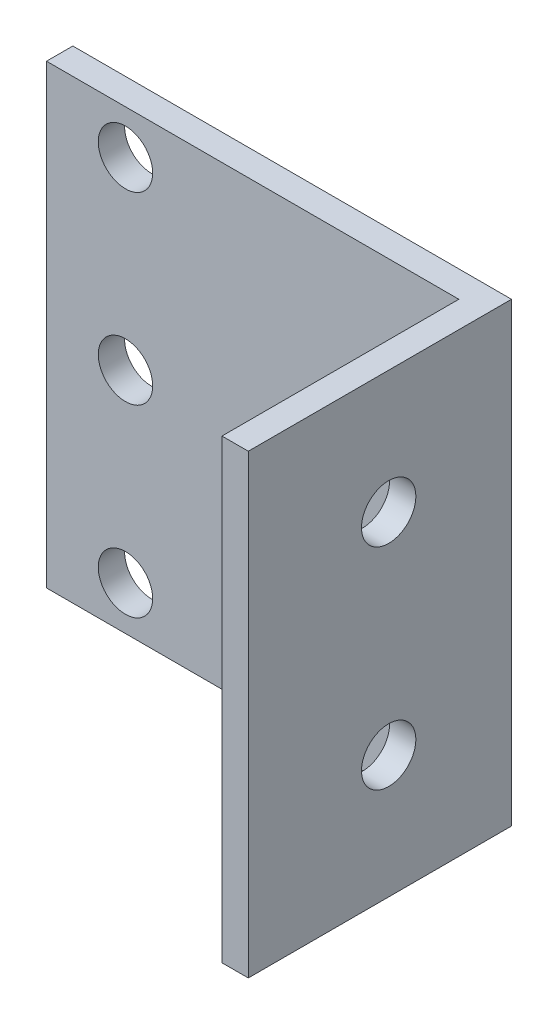
ISO-10303-21;
HEADER;
FILE_DESCRIPTION(('STEP AP214'),'2;1');
FILE_NAME('part.step','',(''),(''),'','','');
FILE_SCHEMA(('AUTOMOTIVE_DESIGN { 1 0 10303 214 1 1 1 1 }'));
ENDSEC;
DATA;
#1=APPLICATION_CONTEXT('core data for automotive mechanical design processes');
#2=APPLICATION_PROTOCOL_DEFINITION('international standard','automotive_design',2000,#1);
#3=PRODUCT_CONTEXT('',#1,'mechanical');
#4=PRODUCT('Part','Part','',(#3));
#5=PRODUCT_RELATED_PRODUCT_CATEGORY('part','',(#4));
#6=PRODUCT_DEFINITION_FORMATION('','',#4);
#7=PRODUCT_DEFINITION_CONTEXT('part definition',#1,'design');
#8=PRODUCT_DEFINITION('design','',#6,#7);
#9=PRODUCT_DEFINITION_SHAPE('','',#8);
#10=(LENGTH_UNIT() NAMED_UNIT(*) SI_UNIT(.MILLI.,.METRE.));
#11=(NAMED_UNIT(*) PLANE_ANGLE_UNIT() SI_UNIT($,.RADIAN.));
#12=(NAMED_UNIT(*) SI_UNIT($,.STERADIAN.) SOLID_ANGLE_UNIT());
#13=UNCERTAINTY_MEASURE_WITH_UNIT(LENGTH_MEASURE(1.E-05),#10,'distance_accuracy_value','');
#14=(GEOMETRIC_REPRESENTATION_CONTEXT(3) GLOBAL_UNCERTAINTY_ASSIGNED_CONTEXT((#13)) GLOBAL_UNIT_ASSIGNED_CONTEXT((#10,
#11,#12)) REPRESENTATION_CONTEXT('',''));
#15=CARTESIAN_POINT('',(0.,0.,0.));
#16=DIRECTION('',(0.,0.,1.));
#17=DIRECTION('',(1.,0.,0.));
#18=AXIS2_PLACEMENT_3D('',#15,#16,#17);
#19=CARTESIAN_POINT('',(0.,0.,1.5));
#20=DIRECTION('',(0.,0.,1.));
#21=DIRECTION('',(1.,0.,0.));
#22=AXIS2_PLACEMENT_3D('',#19,#20,#21);
#23=PLANE('',#22);
#24=DIRECTION('',(0.,-1.,0.));
#25=VECTOR('',#24,1.);
#26=CARTESIAN_POINT('',(19.,13.,1.5));
#27=LINE('',#26,#25);
#28=CARTESIAN_POINT('',(19.,13.,1.5));
#29=VERTEX_POINT('',#28);
#30=CARTESIAN_POINT('',(19.,-13.,1.5));
#31=VERTEX_POINT('',#30);
#32=EDGE_CURVE('E49',#29,#31,#27,.T.);
#33=ORIENTED_EDGE('',*,*,#32,.F.);
#34=DIRECTION('',(-1.,0.,0.));
#35=VECTOR('',#34,1.);
#36=CARTESIAN_POINT('',(-4.5,13.,1.5));
#37=LINE('',#36,#35);
#38=CARTESIAN_POINT('',(-4.5,13.,1.5));
#39=VERTEX_POINT('',#38);
#40=EDGE_CURVE('E54',#29,#39,#37,.T.);
#41=ORIENTED_EDGE('',*,*,#40,.T.);
#42=DIRECTION('',(0.,-1.,0.));
#43=VECTOR('',#42,1.);
#44=CARTESIAN_POINT('',(-4.5,13.,1.5));
#45=LINE('',#44,#43);
#46=CARTESIAN_POINT('',(-4.5,-13.,1.5));
#47=VERTEX_POINT('',#46);
#48=EDGE_CURVE('E85',#39,#47,#45,.T.);
#49=ORIENTED_EDGE('',*,*,#48,.T.);
#50=DIRECTION('',(1.,0.,0.));
#51=VECTOR('',#50,1.);
#52=CARTESIAN_POINT('',(-4.5,-13.,1.5));
#53=LINE('',#52,#51);
#54=EDGE_CURVE('E110',#47,#31,#53,.T.);
#55=ORIENTED_EDGE('',*,*,#54,.T.);
#56=EDGE_LOOP('',(#33,#41,#49,#55));
#57=FACE_BOUND('',#56,.T.);
#58=CARTESIAN_POINT('',(0.,0.,1.5));
#59=DIRECTION('',(0.,0.,1.));
#60=DIRECTION('',(1.,0.,0.));
#61=AXIS2_PLACEMENT_3D('',#58,#59,#60);
#62=CIRCLE('',#61,1.55);
#63=CARTESIAN_POINT('',(1.55,0.,1.5));
#64=VERTEX_POINT('',#63);
#65=EDGE_CURVE('E117',#64,#64,#62,.T.);
#66=ORIENTED_EDGE('',*,*,#65,.F.);
#67=EDGE_LOOP('',(#66));
#68=FACE_BOUND('',#67,.T.);
#69=CARTESIAN_POINT('',(0.,10.5,1.5));
#70=DIRECTION('',(0.,0.,1.));
#71=DIRECTION('',(1.,0.,0.));
#72=AXIS2_PLACEMENT_3D('',#69,#70,#71);
#73=CIRCLE('',#72,1.55);
#74=CARTESIAN_POINT('',(1.55,10.5,1.5));
#75=VERTEX_POINT('',#74);
#76=EDGE_CURVE('E96',#75,#75,#73,.T.);
#77=ORIENTED_EDGE('',*,*,#76,.F.);
#78=EDGE_LOOP('',(#77));
#79=FACE_BOUND('',#78,.T.);
#80=CARTESIAN_POINT('',(0.,-10.5,1.5));
#81=DIRECTION('',(0.,0.,1.));
#82=DIRECTION('',(1.,0.,0.));
#83=AXIS2_PLACEMENT_3D('',#80,#81,#82);
#84=CIRCLE('',#83,1.55);
#85=CARTESIAN_POINT('',(1.55,-10.5,1.5));
#86=VERTEX_POINT('',#85);
#87=EDGE_CURVE('E122',#86,#86,#84,.T.);
#88=ORIENTED_EDGE('',*,*,#87,.F.);
#89=EDGE_LOOP('',(#88));
#90=FACE_BOUND('',#89,.T.);
#91=ADVANCED_FACE('F32',(#57,#68,#79,#90),#23,.T.);
#92=CARTESIAN_POINT('',(0.,0.,0.));
#93=DIRECTION('',(0.,0.,1.));
#94=DIRECTION('',(1.,0.,0.));
#95=AXIS2_PLACEMENT_3D('',#92,#93,#94);
#96=PLANE('',#95);
#97=CARTESIAN_POINT('',(0.,0.,0.));
#98=DIRECTION('',(0.,0.,1.));
#99=DIRECTION('',(1.,0.,0.));
#100=AXIS2_PLACEMENT_3D('',#97,#98,#99);
#101=CIRCLE('',#100,1.55);
#102=CARTESIAN_POINT('',(1.55,0.,0.));
#103=VERTEX_POINT('',#102);
#104=EDGE_CURVE('E119',#103,#103,#101,.T.);
#105=ORIENTED_EDGE('',*,*,#104,.T.);
#106=EDGE_LOOP('',(#105));
#107=FACE_BOUND('',#106,.T.);
#108=DIRECTION('',(0.,-1.,0.));
#109=VECTOR('',#108,1.);
#110=CARTESIAN_POINT('',(-4.5,13.,0.));
#111=LINE('',#110,#109);
#112=CARTESIAN_POINT('',(-4.5,13.,0.));
#113=VERTEX_POINT('',#112);
#114=CARTESIAN_POINT('',(-4.5,-13.,0.));
#115=VERTEX_POINT('',#114);
#116=EDGE_CURVE('E91',#113,#115,#111,.T.);
#117=ORIENTED_EDGE('',*,*,#116,.F.);
#118=DIRECTION('',(-1.,0.,0.));
#119=VECTOR('',#118,1.);
#120=CARTESIAN_POINT('',(-4.5,13.,0.));
#121=LINE('',#120,#119);
#122=CARTESIAN_POINT('',(20.5,13.,0.));
#123=VERTEX_POINT('',#122);
#124=EDGE_CURVE('E74',#123,#113,#121,.T.);
#125=ORIENTED_EDGE('',*,*,#124,.F.);
#126=DIRECTION('',(0.,1.,0.));
#127=VECTOR('',#126,1.);
#128=CARTESIAN_POINT('',(20.5,13.,0.));
#129=LINE('',#128,#127);
#130=CARTESIAN_POINT('',(20.5,-13.,0.));
#131=VERTEX_POINT('',#130);
#132=EDGE_CURVE('E86',#131,#123,#129,.T.);
#133=ORIENTED_EDGE('',*,*,#132,.F.);
#134=DIRECTION('',(1.,0.,0.));
#135=VECTOR('',#134,1.);
#136=CARTESIAN_POINT('',(-4.5,-13.,0.));
#137=LINE('',#136,#135);
#138=EDGE_CURVE('E95',#115,#131,#137,.T.);
#139=ORIENTED_EDGE('',*,*,#138,.F.);
#140=EDGE_LOOP('',(#117,#125,#133,#139));
#141=FACE_BOUND('',#140,.T.);
#142=CARTESIAN_POINT('',(0.,10.5,0.));
#143=DIRECTION('',(0.,0.,1.));
#144=DIRECTION('',(1.,0.,0.));
#145=AXIS2_PLACEMENT_3D('',#142,#143,#144);
#146=CIRCLE('',#145,1.55);
#147=CARTESIAN_POINT('',(1.55,10.5,0.));
#148=VERTEX_POINT('',#147);
#149=EDGE_CURVE('E100',#148,#148,#146,.T.);
#150=ORIENTED_EDGE('',*,*,#149,.T.);
#151=EDGE_LOOP('',(#150));
#152=FACE_BOUND('',#151,.T.);
#153=CARTESIAN_POINT('',(0.,-10.5,0.));
#154=DIRECTION('',(0.,0.,1.));
#155=DIRECTION('',(1.,0.,0.));
#156=AXIS2_PLACEMENT_3D('',#153,#154,#155);
#157=CIRCLE('',#156,1.55);
#158=CARTESIAN_POINT('',(1.55,-10.5,0.));
#159=VERTEX_POINT('',#158);
#160=EDGE_CURVE('E125',#159,#159,#157,.T.);
#161=ORIENTED_EDGE('',*,*,#160,.T.);
#162=EDGE_LOOP('',(#161));
#163=FACE_BOUND('',#162,.T.);
#164=ADVANCED_FACE('F93',(#107,#141,#152,#163),#96,.F.);
#165=CARTESIAN_POINT('',(-4.5,13.,1.5));
#166=DIRECTION('',(1.,0.,0.));
#167=DIRECTION('',(0.,0.,-1.));
#168=AXIS2_PLACEMENT_3D('',#165,#166,#167);
#169=PLANE('',#168);
#170=ORIENTED_EDGE('',*,*,#116,.T.);
#171=DIRECTION('',(0.,0.,-1.));
#172=VECTOR('',#171,1.);
#173=CARTESIAN_POINT('',(-4.5,-13.,1.5));
#174=LINE('',#173,#172);
#175=EDGE_CURVE('E11',#47,#115,#174,.T.);
#176=ORIENTED_EDGE('',*,*,#175,.F.);
#177=ORIENTED_EDGE('',*,*,#48,.F.);
#178=DIRECTION('',(0.,0.,-1.));
#179=VECTOR('',#178,1.);
#180=CARTESIAN_POINT('',(-4.5,13.,1.5));
#181=LINE('',#180,#179);
#182=EDGE_CURVE('E77',#39,#113,#181,.T.);
#183=ORIENTED_EDGE('',*,*,#182,.T.);
#184=EDGE_LOOP('',(#170,#176,#177,#183));
#185=FACE_BOUND('',#184,.T.);
#186=ADVANCED_FACE('F34',(#185),#169,.F.);
#187=CARTESIAN_POINT('',(-4.5,-13.,1.5));
#188=DIRECTION('',(0.,1.,0.));
#189=DIRECTION('',(0.,0.,1.));
#190=AXIS2_PLACEMENT_3D('',#187,#188,#189);
#191=PLANE('',#190);
#192=ORIENTED_EDGE('',*,*,#138,.T.);
#193=DIRECTION('',(0.,0.,-1.));
#194=VECTOR('',#193,1.);
#195=CARTESIAN_POINT('',(20.5,-13.,1.5));
#196=LINE('',#195,#194);
#197=CARTESIAN_POINT('',(20.5,-13.,15.));
#198=VERTEX_POINT('',#197);
#199=EDGE_CURVE('E41',#198,#131,#196,.T.);
#200=ORIENTED_EDGE('',*,*,#199,.F.);
#201=DIRECTION('',(1.,0.,0.));
#202=VECTOR('',#201,1.);
#203=CARTESIAN_POINT('',(20.5,-13.,15.));
#204=LINE('',#203,#202);
#205=CARTESIAN_POINT('',(19.,-13.,15.));
#206=VERTEX_POINT('',#205);
#207=EDGE_CURVE('E133',#206,#198,#204,.T.);
#208=ORIENTED_EDGE('',*,*,#207,.F.);
#209=DIRECTION('',(0.,0.,-1.));
#210=VECTOR('',#209,1.);
#211=CARTESIAN_POINT('',(19.,-13.,15.));
#212=LINE('',#211,#210);
#213=EDGE_CURVE('E138',#206,#31,#212,.T.);
#214=ORIENTED_EDGE('',*,*,#213,.T.);
#215=ORIENTED_EDGE('',*,*,#54,.F.);
#216=ORIENTED_EDGE('',*,*,#175,.T.);
#217=EDGE_LOOP('',(#192,#200,#208,#214,#215,#216));
#218=FACE_BOUND('',#217,.T.);
#219=ADVANCED_FACE('F187',(#218),#191,.F.);
#220=CARTESIAN_POINT('',(20.5,13.,1.5));
#221=DIRECTION('',(-1.,0.,0.));
#222=DIRECTION('',(0.,0.,1.));
#223=AXIS2_PLACEMENT_3D('',#220,#221,#222);
#224=PLANE('',#223);
#225=CARTESIAN_POINT('',(20.5,-6.,7.));
#226=DIRECTION('',(1.,0.,0.));
#227=DIRECTION('',(0.,0.,-1.));
#228=AXIS2_PLACEMENT_3D('',#225,#226,#227);
#229=CIRCLE('',#228,1.55);
#230=CARTESIAN_POINT('',(20.5,-6.,5.45));
#231=VERTEX_POINT('',#230);
#232=EDGE_CURVE('E155',#231,#231,#229,.T.);
#233=ORIENTED_EDGE('',*,*,#232,.F.);
#234=EDGE_LOOP('',(#233));
#235=FACE_BOUND('',#234,.T.);
#236=CARTESIAN_POINT('',(20.5,6.,7.));
#237=DIRECTION('',(1.,0.,0.));
#238=DIRECTION('',(0.,0.,-1.));
#239=AXIS2_PLACEMENT_3D('',#236,#237,#238);
#240=CIRCLE('',#239,1.55);
#241=CARTESIAN_POINT('',(20.5,6.,5.45));
#242=VERTEX_POINT('',#241);
#243=EDGE_CURVE('E147',#242,#242,#240,.T.);
#244=ORIENTED_EDGE('',*,*,#243,.F.);
#245=EDGE_LOOP('',(#244));
#246=FACE_BOUND('',#245,.T.);
#247=ORIENTED_EDGE('',*,*,#132,.T.);
#248=DIRECTION('',(0.,0.,-1.));
#249=VECTOR('',#248,1.);
#250=CARTESIAN_POINT('',(20.5,13.,1.5));
#251=LINE('',#250,#249);
#252=CARTESIAN_POINT('',(20.5,13.,15.));
#253=VERTEX_POINT('',#252);
#254=EDGE_CURVE('E81',#253,#123,#251,.T.);
#255=ORIENTED_EDGE('',*,*,#254,.F.);
#256=DIRECTION('',(0.,1.,0.));
#257=VECTOR('',#256,1.);
#258=CARTESIAN_POINT('',(20.5,13.,15.));
#259=LINE('',#258,#257);
#260=EDGE_CURVE('E136',#198,#253,#259,.T.);
#261=ORIENTED_EDGE('',*,*,#260,.F.);
#262=ORIENTED_EDGE('',*,*,#199,.T.);
#263=EDGE_LOOP('',(#247,#255,#261,#262));
#264=FACE_BOUND('',#263,.T.);
#265=ADVANCED_FACE('F177',(#235,#246,#264),#224,.F.);
#266=CARTESIAN_POINT('',(-4.5,13.,1.5));
#267=DIRECTION('',(0.,-1.,0.));
#268=DIRECTION('',(0.,0.,-1.));
#269=AXIS2_PLACEMENT_3D('',#266,#267,#268);
#270=PLANE('',#269);
#271=ORIENTED_EDGE('',*,*,#124,.T.);
#272=ORIENTED_EDGE('',*,*,#182,.F.);
#273=ORIENTED_EDGE('',*,*,#40,.F.);
#274=DIRECTION('',(0.,0.,-1.));
#275=VECTOR('',#274,1.);
#276=CARTESIAN_POINT('',(19.,13.,15.));
#277=LINE('',#276,#275);
#278=CARTESIAN_POINT('',(19.,13.,15.));
#279=VERTEX_POINT('',#278);
#280=EDGE_CURVE('E128',#279,#29,#277,.T.);
#281=ORIENTED_EDGE('',*,*,#280,.F.);
#282=DIRECTION('',(-1.,0.,0.));
#283=VECTOR('',#282,1.);
#284=CARTESIAN_POINT('',(20.5,13.,15.));
#285=LINE('',#284,#283);
#286=EDGE_CURVE('E160',#253,#279,#285,.T.);
#287=ORIENTED_EDGE('',*,*,#286,.F.);
#288=ORIENTED_EDGE('',*,*,#254,.T.);
#289=EDGE_LOOP('',(#271,#272,#273,#281,#287,#288));
#290=FACE_BOUND('',#289,.T.);
#291=ADVANCED_FACE('F76',(#290),#270,.F.);
#292=CARTESIAN_POINT('',(0.,10.5,1.5));
#293=DIRECTION('',(0.,0.,-1.));
#294=DIRECTION('',(-1.,0.,0.));
#295=AXIS2_PLACEMENT_3D('',#292,#293,#294);
#296=CYLINDRICAL_SURFACE('',#295,1.55);
#297=ORIENTED_EDGE('',*,*,#76,.T.);
#298=EDGE_LOOP('',(#297));
#299=FACE_BOUND('',#298,.T.);
#300=ORIENTED_EDGE('',*,*,#149,.F.);
#301=EDGE_LOOP('',(#300));
#302=FACE_BOUND('',#301,.T.);
#303=ADVANCED_FACE('F203',(#299,#302),#296,.F.);
#304=CARTESIAN_POINT('',(0.,0.,1.5));
#305=DIRECTION('',(0.,0.,-1.));
#306=DIRECTION('',(-1.,0.,0.));
#307=AXIS2_PLACEMENT_3D('',#304,#305,#306);
#308=CYLINDRICAL_SURFACE('',#307,1.55);
#309=ORIENTED_EDGE('',*,*,#65,.T.);
#310=EDGE_LOOP('',(#309));
#311=FACE_BOUND('',#310,.T.);
#312=ORIENTED_EDGE('',*,*,#104,.F.);
#313=EDGE_LOOP('',(#312));
#314=FACE_BOUND('',#313,.T.);
#315=ADVANCED_FACE('F210',(#311,#314),#308,.F.);
#316=CARTESIAN_POINT('',(0.,-10.5,1.5));
#317=DIRECTION('',(0.,0.,-1.));
#318=DIRECTION('',(-1.,0.,0.));
#319=AXIS2_PLACEMENT_3D('',#316,#317,#318);
#320=CYLINDRICAL_SURFACE('',#319,1.55);
#321=ORIENTED_EDGE('',*,*,#87,.T.);
#322=EDGE_LOOP('',(#321));
#323=FACE_BOUND('',#322,.T.);
#324=ORIENTED_EDGE('',*,*,#160,.F.);
#325=EDGE_LOOP('',(#324));
#326=FACE_BOUND('',#325,.T.);
#327=ADVANCED_FACE('F215',(#323,#326),#320,.F.);
#328=CARTESIAN_POINT('',(19.,13.,15.));
#329=DIRECTION('',(1.,0.,0.));
#330=DIRECTION('',(0.,1.,0.));
#331=AXIS2_PLACEMENT_3D('',#328,#329,#330);
#332=PLANE('',#331);
#333=CARTESIAN_POINT('',(19.,-6.,7.));
#334=DIRECTION('',(1.,0.,0.));
#335=DIRECTION('',(0.,1.,0.));
#336=AXIS2_PLACEMENT_3D('',#333,#334,#335);
#337=CIRCLE('',#336,1.55);
#338=CARTESIAN_POINT('',(19.,-6.,5.45));
#339=VERTEX_POINT('',#338);
#340=EDGE_CURVE('E36',#339,#339,#337,.T.);
#341=ORIENTED_EDGE('',*,*,#340,.T.);
#342=EDGE_LOOP('',(#341));
#343=FACE_BOUND('',#342,.T.);
#344=CARTESIAN_POINT('',(19.,6.,7.));
#345=DIRECTION('',(1.,0.,0.));
#346=DIRECTION('',(0.,1.,0.));
#347=AXIS2_PLACEMENT_3D('',#344,#345,#346);
#348=CIRCLE('',#347,1.55);
#349=CARTESIAN_POINT('',(19.,6.,5.45));
#350=VERTEX_POINT('',#349);
#351=EDGE_CURVE('E137',#350,#350,#348,.T.);
#352=ORIENTED_EDGE('',*,*,#351,.T.);
#353=EDGE_LOOP('',(#352));
#354=FACE_BOUND('',#353,.T.);
#355=ORIENTED_EDGE('',*,*,#32,.T.);
#356=ORIENTED_EDGE('',*,*,#213,.F.);
#357=DIRECTION('',(0.,-1.,0.));
#358=VECTOR('',#357,1.);
#359=CARTESIAN_POINT('',(19.,13.,15.));
#360=LINE('',#359,#358);
#361=EDGE_CURVE('E162',#279,#206,#360,.T.);
#362=ORIENTED_EDGE('',*,*,#361,.F.);
#363=ORIENTED_EDGE('',*,*,#280,.T.);
#364=EDGE_LOOP('',(#355,#356,#362,#363));
#365=FACE_BOUND('',#364,.T.);
#366=ADVANCED_FACE('F186',(#343,#354,#365),#332,.F.);
#367=CARTESIAN_POINT('',(0.,0.,15.));
#368=DIRECTION('',(0.,0.,-1.));
#369=DIRECTION('',(-1.,0.,0.));
#370=AXIS2_PLACEMENT_3D('',#367,#368,#369);
#371=PLANE('',#370);
#372=ORIENTED_EDGE('',*,*,#260,.T.);
#373=ORIENTED_EDGE('',*,*,#286,.T.);
#374=ORIENTED_EDGE('',*,*,#361,.T.);
#375=ORIENTED_EDGE('',*,*,#207,.T.);
#376=EDGE_LOOP('',(#372,#373,#374,#375));
#377=FACE_BOUND('',#376,.T.);
#378=ADVANCED_FACE('F171',(#377),#371,.F.);
#379=CARTESIAN_POINT('',(7.50000000000001,6.,7.));
#380=DIRECTION('',(1.,0.,0.));
#381=DIRECTION('',(0.,0.,-1.));
#382=AXIS2_PLACEMENT_3D('',#379,#380,#381);
#383=CYLINDRICAL_SURFACE('',#382,1.55);
#384=CARTESIAN_POINT('',(20.5,6.,5.45));
#385=CARTESIAN_POINT('',(20.484375,6.,5.45));
#386=CARTESIAN_POINT('',(20.46875,6.,5.45));
#387=CARTESIAN_POINT('',(20.4375,6.,5.45));
#388=CARTESIAN_POINT('',(20.421875,6.,5.45));
#389=CARTESIAN_POINT('',(20.390625,6.,5.45));
#390=CARTESIAN_POINT('',(20.375,6.,5.45));
#391=CARTESIAN_POINT('',(20.34375,6.,5.45));
#392=CARTESIAN_POINT('',(20.328125,6.,5.45));
#393=CARTESIAN_POINT('',(20.296875,6.,5.45));
#394=CARTESIAN_POINT('',(20.28125,6.,5.45));
#395=CARTESIAN_POINT('',(20.25,6.,5.45));
#396=CARTESIAN_POINT('',(20.234375,6.,5.45));
#397=CARTESIAN_POINT('',(20.203125,6.,5.45));
#398=CARTESIAN_POINT('',(20.1875,6.,5.45));
#399=CARTESIAN_POINT('',(20.15625,6.,5.45));
#400=CARTESIAN_POINT('',(20.140625,6.,5.45));
#401=CARTESIAN_POINT('',(20.109375,6.,5.45));
#402=CARTESIAN_POINT('',(20.09375,6.,5.45));
#403=CARTESIAN_POINT('',(20.0625,6.,5.45));
#404=CARTESIAN_POINT('',(20.046875,6.,5.45));
#405=CARTESIAN_POINT('',(20.015625,6.,5.45));
#406=CARTESIAN_POINT('',(20.,6.,5.45));
#407=CARTESIAN_POINT('',(19.96875,6.,5.45));
#408=CARTESIAN_POINT('',(19.953125,6.,5.45));
#409=CARTESIAN_POINT('',(19.921875,6.,5.45));
#410=CARTESIAN_POINT('',(19.90625,6.,5.45));
#411=CARTESIAN_POINT('',(19.875,6.,5.45));
#412=CARTESIAN_POINT('',(19.859375,6.,5.45));
#413=CARTESIAN_POINT('',(19.828125,6.,5.45));
#414=CARTESIAN_POINT('',(19.8125,6.,5.45));
#415=CARTESIAN_POINT('',(19.78125,6.,5.45));
#416=CARTESIAN_POINT('',(19.765625,6.,5.45));
#417=CARTESIAN_POINT('',(19.734375,6.,5.45));
#418=CARTESIAN_POINT('',(19.71875,6.,5.45));
#419=CARTESIAN_POINT('',(19.6875,6.,5.45));
#420=CARTESIAN_POINT('',(19.671875,6.,5.45));
#421=CARTESIAN_POINT('',(19.640625,6.,5.45));
#422=CARTESIAN_POINT('',(19.625,6.,5.45));
#423=CARTESIAN_POINT('',(19.59375,6.,5.45));
#424=CARTESIAN_POINT('',(19.578125,6.,5.45));
#425=CARTESIAN_POINT('',(19.546875,6.,5.45));
#426=CARTESIAN_POINT('',(19.53125,6.,5.45));
#427=CARTESIAN_POINT('',(19.5,6.,5.45));
#428=CARTESIAN_POINT('',(19.484375,6.,5.45));
#429=CARTESIAN_POINT('',(19.453125,6.,5.45));
#430=CARTESIAN_POINT('',(19.4375,6.,5.45));
#431=CARTESIAN_POINT('',(19.40625,6.,5.45));
#432=CARTESIAN_POINT('',(19.390625,6.,5.45));
#433=CARTESIAN_POINT('',(19.359375,6.,5.45));
#434=CARTESIAN_POINT('',(19.34375,6.,5.45));
#435=CARTESIAN_POINT('',(19.3125,6.,5.45));
#436=CARTESIAN_POINT('',(19.296875,6.,5.45));
#437=CARTESIAN_POINT('',(19.265625,6.,5.45));
#438=CARTESIAN_POINT('',(19.25,6.,5.45));
#439=CARTESIAN_POINT('',(19.21875,6.,5.45));
#440=CARTESIAN_POINT('',(19.203125,6.,5.45));
#441=CARTESIAN_POINT('',(19.171875,6.,5.45));
#442=CARTESIAN_POINT('',(19.15625,6.,5.45));
#443=CARTESIAN_POINT('',(19.125,6.,5.45));
#444=CARTESIAN_POINT('',(19.109375,6.,5.45));
#445=CARTESIAN_POINT('',(19.078125,6.,5.45));
#446=CARTESIAN_POINT('',(19.0625,6.,5.45));
#447=CARTESIAN_POINT('',(19.03125,6.,5.45));
#448=CARTESIAN_POINT('',(19.015625,6.,5.45));
#449=CARTESIAN_POINT('',(19.,6.,5.45));
#450=B_SPLINE_CURVE_WITH_KNOTS('',3,(#384,#385,#386,#387,#388,#389,#390,#391,#392,#393,#394,
#395,#396,#397,#398,#399,#400,#401,#402,#403,#404,#405,#406,#407,#408,#409,#410,#411,#412,#413,
#414,#415,#416,#417,#418,#419,#420,#421,#422,#423,#424,#425,#426,#427,#428,#429,#430,#431,#432,
#433,#434,#435,#436,#437,#438,#439,#440,#441,#442,#443,#444,#445,#446,#447,#448,#449),
.UNSPECIFIED.,.F.,.F.,(4,2,2,2,2,2,2,2,2,2,2,2,2,2,2,2,2,2,2,2,2,2,2,2,2,2,2,2,2,2,2,2,4),(0.,
0.0468749999999983,0.0937500000000001,0.140625000000002,0.1875,0.234374999999998,0.28125,
0.328125000000002,0.375,0.421874999999999,0.46875,0.515625000000002,0.5625,0.609374999999999,
0.656250000000001,0.703125000000002,0.750000000000001,0.796874999999999,0.843750000000001,
0.890625000000003,0.937500000000001,0.984374999999999,1.03125,1.078125,1.125,1.171875,1.21875,
1.265625,1.3125,1.359375,1.40625,1.453125,1.5),.UNSPECIFIED.);
#451=EDGE_CURVE('BSEAM234',#242,#350,#450,.T.);
#452=ORIENTED_EDGE('',*,*,#243,.T.);
#453=ORIENTED_EDGE('',*,*,#351,.F.);
#454=ORIENTED_EDGE('',*,*,#451,.T.);
#455=ORIENTED_EDGE('',*,*,#451,.F.);
#456=EDGE_LOOP('',(#452,#454,#453,#455));
#457=FACE_BOUND('',#456,.T.);
#458=ADVANCED_FACE('F234',(#457),#383,.F.);
#459=CARTESIAN_POINT('',(7.50000000000001,-6.,7.));
#460=DIRECTION('',(1.,0.,0.));
#461=DIRECTION('',(0.,0.,-1.));
#462=AXIS2_PLACEMENT_3D('',#459,#460,#461);
#463=CYLINDRICAL_SURFACE('',#462,1.55);
#464=CARTESIAN_POINT('',(20.5,-6.,5.45));
#465=CARTESIAN_POINT('',(20.484375,-6.,5.45));
#466=CARTESIAN_POINT('',(20.46875,-6.,5.45));
#467=CARTESIAN_POINT('',(20.4375,-6.,5.45));
#468=CARTESIAN_POINT('',(20.421875,-6.,5.45));
#469=CARTESIAN_POINT('',(20.390625,-6.,5.45));
#470=CARTESIAN_POINT('',(20.375,-6.,5.45));
#471=CARTESIAN_POINT('',(20.34375,-6.,5.45));
#472=CARTESIAN_POINT('',(20.328125,-6.,5.45));
#473=CARTESIAN_POINT('',(20.296875,-6.,5.45));
#474=CARTESIAN_POINT('',(20.28125,-6.,5.45));
#475=CARTESIAN_POINT('',(20.25,-6.,5.45));
#476=CARTESIAN_POINT('',(20.234375,-6.,5.45));
#477=CARTESIAN_POINT('',(20.203125,-6.,5.45));
#478=CARTESIAN_POINT('',(20.1875,-6.,5.45));
#479=CARTESIAN_POINT('',(20.15625,-6.,5.45));
#480=CARTESIAN_POINT('',(20.140625,-6.,5.45));
#481=CARTESIAN_POINT('',(20.109375,-6.,5.45));
#482=CARTESIAN_POINT('',(20.09375,-6.,5.45));
#483=CARTESIAN_POINT('',(20.0625,-6.,5.45));
#484=CARTESIAN_POINT('',(20.046875,-6.,5.45));
#485=CARTESIAN_POINT('',(20.015625,-6.,5.45));
#486=CARTESIAN_POINT('',(20.,-6.,5.45));
#487=CARTESIAN_POINT('',(19.96875,-6.,5.45));
#488=CARTESIAN_POINT('',(19.953125,-6.,5.45));
#489=CARTESIAN_POINT('',(19.921875,-6.,5.45));
#490=CARTESIAN_POINT('',(19.90625,-6.,5.45));
#491=CARTESIAN_POINT('',(19.875,-6.,5.45));
#492=CARTESIAN_POINT('',(19.859375,-6.,5.45));
#493=CARTESIAN_POINT('',(19.828125,-6.,5.45));
#494=CARTESIAN_POINT('',(19.8125,-6.,5.45));
#495=CARTESIAN_POINT('',(19.78125,-6.,5.45));
#496=CARTESIAN_POINT('',(19.765625,-6.,5.45));
#497=CARTESIAN_POINT('',(19.734375,-6.,5.45));
#498=CARTESIAN_POINT('',(19.71875,-6.,5.45));
#499=CARTESIAN_POINT('',(19.6875,-6.,5.45));
#500=CARTESIAN_POINT('',(19.671875,-6.,5.45));
#501=CARTESIAN_POINT('',(19.640625,-6.,5.45));
#502=CARTESIAN_POINT('',(19.625,-6.,5.45));
#503=CARTESIAN_POINT('',(19.59375,-6.,5.45));
#504=CARTESIAN_POINT('',(19.578125,-6.,5.45));
#505=CARTESIAN_POINT('',(19.546875,-6.,5.45));
#506=CARTESIAN_POINT('',(19.53125,-6.,5.45));
#507=CARTESIAN_POINT('',(19.5,-6.,5.45));
#508=CARTESIAN_POINT('',(19.484375,-6.,5.45));
#509=CARTESIAN_POINT('',(19.453125,-6.,5.45));
#510=CARTESIAN_POINT('',(19.4375,-6.,5.45));
#511=CARTESIAN_POINT('',(19.40625,-6.,5.45));
#512=CARTESIAN_POINT('',(19.390625,-6.,5.45));
#513=CARTESIAN_POINT('',(19.359375,-6.,5.45));
#514=CARTESIAN_POINT('',(19.34375,-6.,5.45));
#515=CARTESIAN_POINT('',(19.3125,-6.,5.45));
#516=CARTESIAN_POINT('',(19.296875,-6.,5.45));
#517=CARTESIAN_POINT('',(19.265625,-6.,5.45));
#518=CARTESIAN_POINT('',(19.25,-6.,5.45));
#519=CARTESIAN_POINT('',(19.21875,-6.,5.45));
#520=CARTESIAN_POINT('',(19.203125,-6.,5.45));
#521=CARTESIAN_POINT('',(19.171875,-6.,5.45));
#522=CARTESIAN_POINT('',(19.15625,-6.,5.45));
#523=CARTESIAN_POINT('',(19.125,-6.,5.45));
#524=CARTESIAN_POINT('',(19.109375,-6.,5.45));
#525=CARTESIAN_POINT('',(19.078125,-6.,5.45));
#526=CARTESIAN_POINT('',(19.0625,-6.,5.45));
#527=CARTESIAN_POINT('',(19.03125,-6.,5.45));
#528=CARTESIAN_POINT('',(19.015625,-6.,5.45));
#529=CARTESIAN_POINT('',(19.,-6.,5.45));
#530=B_SPLINE_CURVE_WITH_KNOTS('',3,(#464,#465,#466,#467,#468,#469,#470,#471,#472,#473,#474,
#475,#476,#477,#478,#479,#480,#481,#482,#483,#484,#485,#486,#487,#488,#489,#490,#491,#492,#493,
#494,#495,#496,#497,#498,#499,#500,#501,#502,#503,#504,#505,#506,#507,#508,#509,#510,#511,#512,
#513,#514,#515,#516,#517,#518,#519,#520,#521,#522,#523,#524,#525,#526,#527,#528,#529),
.UNSPECIFIED.,.F.,.F.,(4,2,2,2,2,2,2,2,2,2,2,2,2,2,2,2,2,2,2,2,2,2,2,2,2,2,2,2,2,2,2,2,4),(0.,
0.0468749999999983,0.0937500000000001,0.140625000000002,0.1875,0.234374999999998,0.28125,
0.328125000000002,0.375,0.421874999999999,0.46875,0.515625000000002,0.5625,0.609374999999999,
0.656250000000001,0.703125000000002,0.750000000000001,0.796874999999999,0.843750000000001,
0.890625000000003,0.937500000000001,0.984374999999999,1.03125,1.078125,1.125,1.171875,1.21875,
1.265625,1.3125,1.359375,1.40625,1.453125,1.5),.UNSPECIFIED.);
#531=EDGE_CURVE('BSEAM237',#231,#339,#530,.T.);
#532=ORIENTED_EDGE('',*,*,#232,.T.);
#533=ORIENTED_EDGE('',*,*,#340,.F.);
#534=ORIENTED_EDGE('',*,*,#531,.T.);
#535=ORIENTED_EDGE('',*,*,#531,.F.);
#536=EDGE_LOOP('',(#532,#534,#533,#535));
#537=FACE_BOUND('',#536,.T.);
#538=ADVANCED_FACE('F237',(#537),#463,.F.);
#539=CLOSED_SHELL('',(#91,#164,#186,#219,#265,#291,#303,#315,#327,#366,#378,#458,#538));
#540=MANIFOLD_SOLID_BREP('B2',#539);
#541=ADVANCED_BREP_SHAPE_REPRESENTATION('',(#18,#540),#14);
#542=SHAPE_DEFINITION_REPRESENTATION(#9,#541);
ENDSEC;
END-ISO-10303-21;
